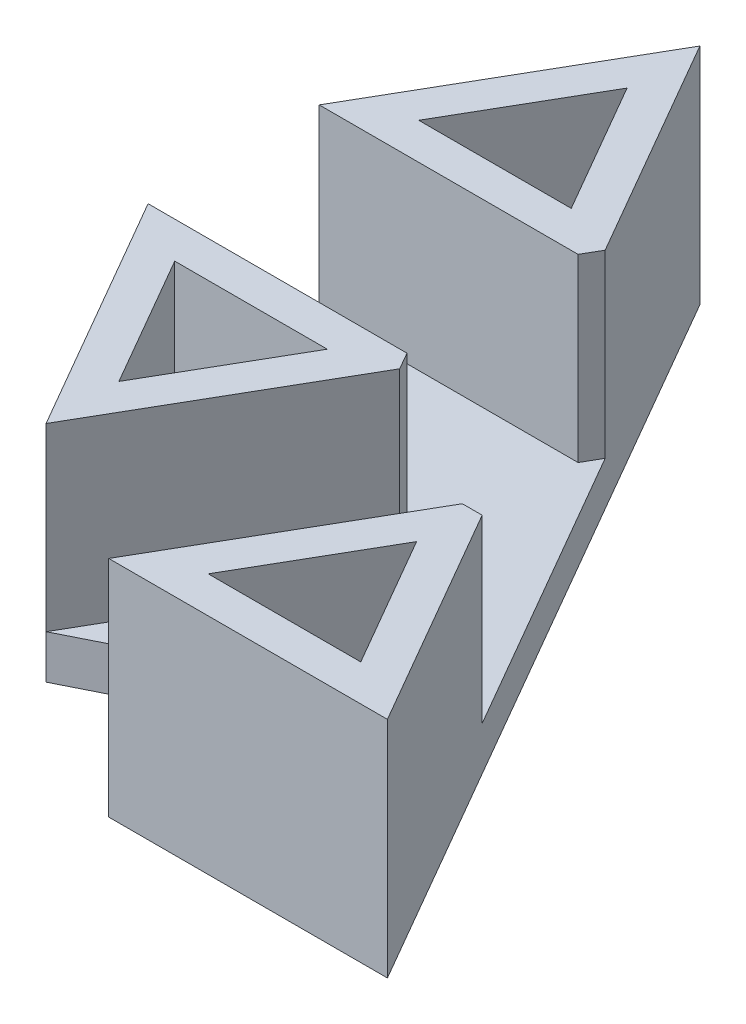
ISO-10303-21;
HEADER;
FILE_DESCRIPTION(('STEP AP214'),'2;1');
FILE_NAME('part.step','',(''),(''),'','','');
FILE_SCHEMA(('AUTOMOTIVE_DESIGN { 1 0 10303 214 1 1 1 1 }'));
ENDSEC;
DATA;
#1=APPLICATION_CONTEXT('core data for automotive mechanical design processes');
#2=APPLICATION_PROTOCOL_DEFINITION('international standard','automotive_design',2000,#1);
#3=PRODUCT_CONTEXT('',#1,'mechanical');
#4=PRODUCT('Part','Part','',(#3));
#5=PRODUCT_RELATED_PRODUCT_CATEGORY('part','',(#4));
#6=PRODUCT_DEFINITION_FORMATION('','',#4);
#7=PRODUCT_DEFINITION_CONTEXT('part definition',#1,'design');
#8=PRODUCT_DEFINITION('design','',#6,#7);
#9=PRODUCT_DEFINITION_SHAPE('','',#8);
#10=(LENGTH_UNIT() NAMED_UNIT(*) SI_UNIT(.MILLI.,.METRE.));
#11=(NAMED_UNIT(*) PLANE_ANGLE_UNIT() SI_UNIT($,.RADIAN.));
#12=(NAMED_UNIT(*) SI_UNIT($,.STERADIAN.) SOLID_ANGLE_UNIT());
#13=UNCERTAINTY_MEASURE_WITH_UNIT(LENGTH_MEASURE(1.E-05),#10,'distance_accuracy_value','');
#14=(GEOMETRIC_REPRESENTATION_CONTEXT(3) GLOBAL_UNCERTAINTY_ASSIGNED_CONTEXT((#13)) GLOBAL_UNIT_ASSIGNED_CONTEXT((#10,
#11,#12)) REPRESENTATION_CONTEXT('',''));
#15=CARTESIAN_POINT('',(0.,0.,0.));
#16=DIRECTION('',(0.,0.,1.));
#17=DIRECTION('',(1.,0.,0.));
#18=AXIS2_PLACEMENT_3D('',#15,#16,#17);
#19=CARTESIAN_POINT('',(0.,15.38,-1.32179677024894));
#20=DIRECTION('',(0.,0.,-1.));
#21=DIRECTION('',(-1.,0.,0.));
#22=AXIS2_PLACEMENT_3D('',#19,#20,#21);
#23=PLANE('',#22);
#24=DIRECTION('',(1.,0.,0.));
#25=VECTOR('',#24,1.);
#26=CARTESIAN_POINT('',(0.,0.,-1.32179677024894));
#27=LINE('',#26,#25);
#28=CARTESIAN_POINT('',(-144.196152421674,0.,-1.32179677024954));
#29=VERTEX_POINT('',#28);
#30=CARTESIAN_POINT('',(-133.72243186399,0.,-1.32179677024951));
#31=VERTEX_POINT('',#30);
#32=EDGE_CURVE('E105',#29,#31,#27,.T.);
#33=ORIENTED_EDGE('',*,*,#32,.F.);
#34=DIRECTION('',(0.,-1.,0.));
#35=VECTOR('',#34,1.);
#36=CARTESIAN_POINT('',(-144.196152421674,15.38,-1.32179677024954));
#37=LINE('',#36,#35);
#38=CARTESIAN_POINT('',(-144.196152421674,15.38,-1.32179677024954));
#39=VERTEX_POINT('',#38);
#40=EDGE_CURVE('E11',#39,#29,#37,.T.);
#41=ORIENTED_EDGE('',*,*,#40,.F.);
#42=DIRECTION('',(1.,0.,0.));
#43=VECTOR('',#42,1.);
#44=CARTESIAN_POINT('',(0.,15.38,-1.32179677024894));
#45=LINE('',#44,#43);
#46=CARTESIAN_POINT('',(-133.72243186399,15.38,-1.32179677024951));
#47=VERTEX_POINT('',#46);
#48=EDGE_CURVE('E104',#39,#47,#45,.T.);
#49=ORIENTED_EDGE('',*,*,#48,.T.);
#50=DIRECTION('',(0.,-1.,0.));
#51=VECTOR('',#50,1.);
#52=CARTESIAN_POINT('',(-133.72243186399,15.38,-1.32179677024951));
#53=LINE('',#52,#51);
#54=EDGE_CURVE('E83',#47,#31,#53,.T.);
#55=ORIENTED_EDGE('',*,*,#54,.T.);
#56=EDGE_LOOP('',(#33,#41,#49,#55));
#57=FACE_BOUND('',#56,.T.);
#58=ADVANCED_FACE('F37',(#57),#23,.T.);
#59=CARTESIAN_POINT('',(-108.719469107093,15.38,-62.7692147551341));
#60=DIRECTION('',(-0.866025403784437,0.,-0.500000000000003));
#61=DIRECTION('',(-0.500000000000003,0.,0.866025403784437));
#62=AXIS2_PLACEMENT_3D('',#59,#60,#61);
#63=PLANE('',#62);
#64=DIRECTION('',(0.500000000000004,0.,-0.866025403784437));
#65=VECTOR('',#64,1.);
#66=CARTESIAN_POINT('',(-108.719469107093,0.,-62.7692147551341));
#67=LINE('',#66,#65);
#68=CARTESIAN_POINT('',(-138.959292142832,0.,-10.3923048453435));
#69=VERTEX_POINT('',#68);
#70=EDGE_CURVE('E129',#29,#69,#67,.T.);
#71=ORIENTED_EDGE('',*,*,#70,.T.);
#72=DIRECTION('',(0.,-1.,0.));
#73=VECTOR('',#72,1.);
#74=CARTESIAN_POINT('',(-138.959292142832,15.38,-10.3923048453435));
#75=LINE('',#74,#73);
#76=CARTESIAN_POINT('',(-138.959292142832,15.38,-10.3923048453435));
#77=VERTEX_POINT('',#76);
#78=EDGE_CURVE('E47',#77,#69,#75,.T.);
#79=ORIENTED_EDGE('',*,*,#78,.F.);
#80=DIRECTION('',(0.500000000000004,0.,-0.866025403784437));
#81=VECTOR('',#80,1.);
#82=CARTESIAN_POINT('',(-108.719469107093,15.38,-62.7692147551341));
#83=LINE('',#82,#81);
#84=EDGE_CURVE('E109',#39,#77,#83,.T.);
#85=ORIENTED_EDGE('',*,*,#84,.F.);
#86=ORIENTED_EDGE('',*,*,#40,.T.);
#87=EDGE_LOOP('',(#71,#79,#85,#86));
#88=FACE_BOUND('',#87,.T.);
#89=ADVANCED_FACE('F110',(#88),#63,.F.);
#90=CARTESIAN_POINT('',(-97.5544055976939,15.38,56.3230623324618));
#91=DIRECTION('',(0.866025403784441,0.,-0.499999999999996));
#92=DIRECTION('',(-0.499999999999996,0.,-0.866025403784441));
#93=AXIS2_PLACEMENT_3D('',#90,#91,#92);
#94=PLANE('',#93);
#95=DIRECTION('',(0.499999999999996,0.,0.866025403784441));
#96=VECTOR('',#95,1.);
#97=CARTESIAN_POINT('',(-97.5544055976939,0.,56.3230623324618));
#98=LINE('',#97,#96);
#99=CARTESIAN_POINT('',(-138.959292142832,0.,-15.3923048453435));
#100=VERTEX_POINT('',#99);
#101=CARTESIAN_POINT('',(-109.649519052832,0.,35.3737113048508));
#102=VERTEX_POINT('',#101);
#103=EDGE_CURVE('E121',#100,#102,#98,.T.);
#104=ORIENTED_EDGE('',*,*,#103,.F.);
#105=DIRECTION('',(0.,-1.,0.));
#106=VECTOR('',#105,1.);
#107=CARTESIAN_POINT('',(-138.959292142832,15.38,-15.3923048453435));
#108=LINE('',#107,#106);
#109=CARTESIAN_POINT('',(-138.959292142832,15.38,-15.3923048453435));
#110=VERTEX_POINT('',#109);
#111=EDGE_CURVE('E41',#110,#100,#108,.T.);
#112=ORIENTED_EDGE('',*,*,#111,.F.);
#113=DIRECTION('',(0.499999999999996,0.,0.866025403784441));
#114=VECTOR('',#113,1.);
#115=CARTESIAN_POINT('',(-97.5544055976939,15.38,56.3230623324618));
#116=LINE('',#115,#114);
#117=CARTESIAN_POINT('',(-130.072540796896,15.38,4.95437024738976E-11));
#118=VERTEX_POINT('',#117);
#119=EDGE_CURVE('E132',#110,#118,#116,.T.);
#120=ORIENTED_EDGE('',*,*,#119,.T.);
#121=DIRECTION('',(0.,-1.,0.));
#122=VECTOR('',#121,1.);
#123=CARTESIAN_POINT('',(-130.072540796896,15.38,4.95437024738976E-11));
#124=LINE('',#123,#122);
#125=CARTESIAN_POINT('',(-130.072540796896,3.,4.95437024738976E-11));
#126=VERTEX_POINT('',#125);
#127=EDGE_CURVE('E120',#118,#126,#124,.T.);
#128=ORIENTED_EDGE('',*,*,#127,.T.);
#129=DIRECTION('',(0.500000000000004,0.,0.866025403784436));
#130=VECTOR('',#129,1.);
#131=CARTESIAN_POINT('',(-97.5544055976927,3.,56.3230623324625));
#132=LINE('',#131,#130);
#133=CARTESIAN_POINT('',(-118.536270398769,3.,19.9814064594578));
#134=VERTEX_POINT('',#133);
#135=EDGE_CURVE('E278',#126,#134,#132,.T.);
#136=ORIENTED_EDGE('',*,*,#135,.T.);
#137=DIRECTION('',(0.,-1.,0.));
#138=VECTOR('',#137,1.);
#139=CARTESIAN_POINT('',(-118.536270398769,15.38,19.9814064594578));
#140=LINE('',#139,#138);
#141=CARTESIAN_POINT('',(-118.536270398769,15.38,19.9814064594578));
#142=VERTEX_POINT('',#141);
#143=EDGE_CURVE('E175',#142,#134,#140,.T.);
#144=ORIENTED_EDGE('',*,*,#143,.F.);
#145=DIRECTION('',(0.500000000000011,0.,0.866025403784432));
#146=VECTOR('',#145,1.);
#147=CARTESIAN_POINT('',(-97.554405597692,15.38,56.3230623324631));
#148=LINE('',#147,#146);
#149=CARTESIAN_POINT('',(-109.649519052832,15.38,35.3737113048508));
#150=VERTEX_POINT('',#149);
#151=EDGE_CURVE('E169',#142,#150,#148,.T.);
#152=ORIENTED_EDGE('',*,*,#151,.T.);
#153=DIRECTION('',(0.,-1.,0.));
#154=VECTOR('',#153,1.);
#155=CARTESIAN_POINT('',(-109.649519052832,15.38,35.3737113048508));
#156=LINE('',#155,#154);
#157=EDGE_CURVE('E164',#150,#102,#156,.T.);
#158=ORIENTED_EDGE('',*,*,#157,.T.);
#159=EDGE_LOOP('',(#104,#112,#120,#128,#136,#144,#152,#158));
#160=FACE_BOUND('',#159,.T.);
#161=ADVANCED_FACE('F39',(#160),#94,.T.);
#162=CARTESIAN_POINT('',(-110.884532616554,15.38,-64.0192147551343));
#163=DIRECTION('',(0.866025403784436,0.,0.500000000000004));
#164=DIRECTION('',(0.500000000000004,0.,-0.866025403784436));
#165=AXIS2_PLACEMENT_3D('',#162,#163,#164);
#166=PLANE('',#165);
#167=DIRECTION('',(-0.500000000000004,0.,0.866025403784436));
#168=VECTOR('',#167,1.);
#169=CARTESIAN_POINT('',(-110.884532616554,0.,-64.0192147551343));
#170=LINE('',#169,#168);
#171=CARTESIAN_POINT('',(-148.526279440597,0.,1.1782032297504));
#172=VERTEX_POINT('',#171);
#173=EDGE_CURVE('E124',#100,#172,#170,.T.);
#174=ORIENTED_EDGE('',*,*,#173,.T.);
#175=DIRECTION('',(0.,-1.,0.));
#176=VECTOR('',#175,1.);
#177=CARTESIAN_POINT('',(-148.526279440597,3.,1.1782032297504));
#178=LINE('',#177,#176);
#179=CARTESIAN_POINT('',(-148.526279440597,3.,1.1782032297504));
#180=VERTEX_POINT('',#179);
#181=EDGE_CURVE('E324',#180,#172,#178,.T.);
#182=ORIENTED_EDGE('',*,*,#181,.F.);
#183=DIRECTION('',(0.,-1.,0.));
#184=VECTOR('',#183,1.);
#185=CARTESIAN_POINT('',(-148.526279440597,15.38,1.1782032297504));
#186=LINE('',#185,#184);
#187=CARTESIAN_POINT('',(-148.526279440597,15.38,1.1782032297504));
#188=VERTEX_POINT('',#187);
#189=EDGE_CURVE('E139',#188,#180,#186,.T.);
#190=ORIENTED_EDGE('',*,*,#189,.F.);
#191=DIRECTION('',(-0.500000000000004,0.,0.866025403784436));
#192=VECTOR('',#191,1.);
#193=CARTESIAN_POINT('',(-110.884532616554,15.38,-64.0192147551343));
#194=LINE('',#193,#192);
#195=EDGE_CURVE('E150',#110,#188,#194,.T.);
#196=ORIENTED_EDGE('',*,*,#195,.F.);
#197=ORIENTED_EDGE('',*,*,#111,.T.);
#198=EDGE_LOOP('',(#174,#182,#190,#196,#197));
#199=FACE_BOUND('',#198,.T.);
#200=ADVANCED_FACE('F148',(#199),#166,.F.);
#201=CARTESIAN_POINT('',(0.,15.38,1.17820322975003));
#202=DIRECTION('',(0.,0.,1.));
#203=DIRECTION('',(1.,0.,0.));
#204=AXIS2_PLACEMENT_3D('',#201,#202,#203);
#205=PLANE('',#204);
#206=DIRECTION('',(-1.,0.,0.));
#207=VECTOR('',#206,1.);
#208=CARTESIAN_POINT('',(0.,3.,1.17820322975003));
#209=LINE('',#208,#207);
#210=CARTESIAN_POINT('',(-130.752776748724,3.,1.17820322975036));
#211=VERTEX_POINT('',#210);
#212=EDGE_CURVE('E284',#211,#180,#209,.T.);
#213=ORIENTED_EDGE('',*,*,#212,.F.);
#214=DIRECTION('',(0.,-1.,0.));
#215=VECTOR('',#214,1.);
#216=CARTESIAN_POINT('',(-130.752776748724,15.38,1.17820322975036));
#217=LINE('',#216,#215);
#218=CARTESIAN_POINT('',(-130.752776748724,15.38,1.17820322975036));
#219=VERTEX_POINT('',#218);
#220=EDGE_CURVE('E137',#219,#211,#217,.T.);
#221=ORIENTED_EDGE('',*,*,#220,.F.);
#222=DIRECTION('',(-1.,0.,0.));
#223=VECTOR('',#222,1.);
#224=CARTESIAN_POINT('',(0.,15.38,1.17820322975003));
#225=LINE('',#224,#223);
#226=EDGE_CURVE('E115',#219,#188,#225,.T.);
#227=ORIENTED_EDGE('',*,*,#226,.T.);
#228=ORIENTED_EDGE('',*,*,#189,.T.);
#229=EDGE_LOOP('',(#213,#221,#227,#228));
#230=FACE_BOUND('',#229,.T.);
#231=ADVANCED_FACE('F329',(#230),#205,.T.);
#232=CARTESIAN_POINT('',(-97.5544055976511,15.38,-56.323062332437));
#233=DIRECTION('',(-0.866025403784442,0.,-0.499999999999995));
#234=DIRECTION('',(-0.499999999999995,0.,0.866025403784442));
#235=AXIS2_PLACEMENT_3D('',#232,#233,#234);
#236=PLANE('',#235);
#237=ORIENTED_EDGE('',*,*,#220,.T.);
#238=DIRECTION('',(0.499999999999995,0.,-0.866025403784442));
#239=VECTOR('',#238,1.);
#240=CARTESIAN_POINT('',(-97.5544055976511,3.,-56.323062332437));
#241=LINE('',#240,#239);
#242=EDGE_CURVE('E281',#211,#126,#241,.T.);
#243=ORIENTED_EDGE('',*,*,#242,.T.);
#244=ORIENTED_EDGE('',*,*,#127,.F.);
#245=DIRECTION('',(0.499999999999995,0.,-0.866025403784442));
#246=VECTOR('',#245,1.);
#247=CARTESIAN_POINT('',(-97.5544055976511,15.38,-56.323062332437));
#248=LINE('',#247,#246);
#249=EDGE_CURVE('E113',#219,#118,#248,.T.);
#250=ORIENTED_EDGE('',*,*,#249,.F.);
#251=EDGE_LOOP('',(#237,#243,#244,#250));
#252=FACE_BOUND('',#251,.T.);
#253=ADVANCED_FACE('F382',(#252),#236,.F.);
#254=CARTESIAN_POINT('',(-99.7194691071534,15.38,57.5730623324625));
#255=DIRECTION('',(0.866025403784435,0.,-0.500000000000005));
#256=DIRECTION('',(-0.500000000000005,0.,-0.866025403784435));
#257=AXIS2_PLACEMENT_3D('',#254,#255,#256);
#258=PLANE('',#257);
#259=DIRECTION('',(0.500000000000006,0.,0.866025403784436));
#260=VECTOR('',#259,1.);
#261=CARTESIAN_POINT('',(-99.7194691071534,0.,57.5730623324625));
#262=LINE('',#261,#260);
#263=EDGE_CURVE('E76',#69,#31,#262,.T.);
#264=ORIENTED_EDGE('',*,*,#263,.T.);
#265=ORIENTED_EDGE('',*,*,#54,.F.);
#266=DIRECTION('',(0.500000000000006,0.,0.866025403784436));
#267=VECTOR('',#266,1.);
#268=CARTESIAN_POINT('',(-99.7194691071534,15.38,57.5730623324625));
#269=LINE('',#268,#267);
#270=EDGE_CURVE('E56',#77,#47,#269,.T.);
#271=ORIENTED_EDGE('',*,*,#270,.F.);
#272=ORIENTED_EDGE('',*,*,#78,.T.);
#273=EDGE_LOOP('',(#264,#265,#271,#272));
#274=FACE_BOUND('',#273,.T.);
#275=ADVANCED_FACE('F524',(#274),#258,.F.);
#276=CARTESIAN_POINT('',(0.,15.38,0.));
#277=DIRECTION('',(0.,1.,0.));
#278=DIRECTION('',(0.,0.,1.));
#279=AXIS2_PLACEMENT_3D('',#276,#277,#278);
#280=PLANE('',#279);
#281=ORIENTED_EDGE('',*,*,#119,.F.);
#282=ORIENTED_EDGE('',*,*,#195,.T.);
#283=ORIENTED_EDGE('',*,*,#226,.F.);
#284=ORIENTED_EDGE('',*,*,#249,.T.);
#285=EDGE_LOOP('',(#281,#282,#283,#284));
#286=FACE_BOUND('',#285,.T.);
#287=ORIENTED_EDGE('',*,*,#48,.F.);
#288=ORIENTED_EDGE('',*,*,#84,.T.);
#289=ORIENTED_EDGE('',*,*,#270,.T.);
#290=EDGE_LOOP('',(#287,#288,#289));
#291=FACE_BOUND('',#290,.T.);
#292=ADVANCED_FACE('F112',(#286,#291),#280,.T.);
#293=CARTESIAN_POINT('',(0.,0.,0.));
#294=DIRECTION('',(0.,1.,0.));
#295=DIRECTION('',(0.,0.,1.));
#296=AXIS2_PLACEMENT_3D('',#293,#294,#295);
#297=PLANE('',#296);
#298=DIRECTION('',(-0.500000000000013,0.,-0.866025403784431));
#299=VECTOR('',#298,1.);
#300=CARTESIAN_POINT('',(-116.992785791573,0.,67.5458163700115));
#301=LINE('',#300,#299);
#302=CARTESIAN_POINT('',(-138.959292142832,0.,29.4987113048487));
#303=VERTEX_POINT('',#302);
#304=CARTESIAN_POINT('',(-148.526279440596,0.,12.9282032297549));
#305=VERTEX_POINT('',#304);
#306=EDGE_CURVE('E219',#303,#305,#301,.T.);
#307=ORIENTED_EDGE('',*,*,#306,.T.);
#308=DIRECTION('',(0.834188655635127,0.,-0.551479180758132));
#309=VECTOR('',#308,1.);
#310=CARTESIAN_POINT('',(-39.2237308648219,0.,-59.331326477527));
#311=LINE('',#310,#309);
#312=CARTESIAN_POINT('',(-139.63952809466,0.,7.05320322975262));
#313=VERTEX_POINT('',#312);
#314=EDGE_CURVE('E309',#305,#313,#311,.T.);
#315=ORIENTED_EDGE('',*,*,#314,.T.);
#316=DIRECTION('',(0.834188655635133,0.,0.551479180758122));
#317=VECTOR('',#316,1.);
#318=CARTESIAN_POINT('',(-45.7132093149093,0.,69.1475616010552));
#319=LINE('',#318,#317);
#320=EDGE_CURVE('E160',#172,#313,#319,.T.);
#321=ORIENTED_EDGE('',*,*,#320,.F.);
#322=ORIENTED_EDGE('',*,*,#173,.F.);
#323=ORIENTED_EDGE('',*,*,#103,.T.);
#324=DIRECTION('',(1.,0.,0.));
#325=VECTOR('',#324,1.);
#326=CARTESIAN_POINT('',(1.92422981832398E-13,0.,35.3737113048502));
#327=LINE('',#326,#325);
#328=CARTESIAN_POINT('',(-128.783493648361,0.,35.3737113048509));
#329=VERTEX_POINT('',#328);
#330=EDGE_CURVE('E178',#329,#102,#327,.T.);
#331=ORIENTED_EDGE('',*,*,#330,.F.);
#332=DIRECTION('',(0.0605006523772137,0.,0.998168157707874));
#333=VECTOR('',#332,1.);
#334=CARTESIAN_POINT('',(-130.448315925334,0.,7.90669202783896));
#335=LINE('',#334,#333);
#336=CARTESIAN_POINT('',(-129.428017222628,0.,24.7400588821532));
#337=VERTEX_POINT('',#336);
#338=EDGE_CURVE('E260',#337,#329,#335,.T.);
#339=ORIENTED_EDGE('',*,*,#338,.F.);
#340=DIRECTION('',(-0.894689308012325,0.,0.446688976949765));
#341=VECTOR('',#340,1.);
#342=CARTESIAN_POINT('',(-15.9375957742609,0.,-31.9219798796541));
#343=LINE('',#342,#341);
#344=EDGE_CURVE('E272',#337,#303,#343,.T.);
#345=ORIENTED_EDGE('',*,*,#344,.T.);
#346=EDGE_LOOP('',(#307,#315,#321,#322,#323,#331,#339,#345));
#347=FACE_BOUND('',#346,.T.);
#348=ORIENTED_EDGE('',*,*,#32,.T.);
#349=ORIENTED_EDGE('',*,*,#263,.F.);
#350=ORIENTED_EDGE('',*,*,#70,.F.);
#351=EDGE_LOOP('',(#348,#349,#350));
#352=FACE_BOUND('',#351,.T.);
#353=DIRECTION('',(0.500000000000014,0.,0.866025403784431));
#354=VECTOR('',#353,1.);
#355=CARTESIAN_POINT('',(-114.827722282112,0.,66.2958163700115));
#356=LINE('',#355,#354);
#357=CARTESIAN_POINT('',(-144.196152421674,0.,15.4282032297548));
#358=VERTEX_POINT('',#357);
#359=CARTESIAN_POINT('',(-138.959292142832,0.,24.4987113048488));
#360=VERTEX_POINT('',#359);
#361=EDGE_CURVE('E208',#358,#360,#356,.T.);
#362=ORIENTED_EDGE('',*,*,#361,.T.);
#363=DIRECTION('',(0.499999999999995,0.,-0.866025403784441));
#364=VECTOR('',#363,1.);
#365=CARTESIAN_POINT('',(-93.6112159321346,0.,-54.0464607175854));
#366=LINE('',#365,#364);
#367=CARTESIAN_POINT('',(-133.72243186399,0.,15.4282032297547));
#368=VERTEX_POINT('',#367);
#369=EDGE_CURVE('E243',#360,#368,#366,.T.);
#370=ORIENTED_EDGE('',*,*,#369,.T.);
#371=DIRECTION('',(1.,0.,0.));
#372=VECTOR('',#371,1.);
#373=CARTESIAN_POINT('',(2.35089077395178E-13,0.,15.4282032297526));
#374=LINE('',#373,#372);
#375=EDGE_CURVE('E240',#358,#368,#374,.T.);
#376=ORIENTED_EDGE('',*,*,#375,.F.);
#377=EDGE_LOOP('',(#362,#370,#376));
#378=FACE_BOUND('',#377,.T.);
#379=DIRECTION('',(-0.500000000000003,0.,-0.866025403784437));
#380=VECTOR('',#379,1.);
#381=CARTESIAN_POINT('',(-99.7194691071538,0.,57.5730623324622));
#382=LINE('',#381,#380);
#383=CARTESIAN_POINT('',(-113.979646071754,0.,32.8737113048507));
#384=VERTEX_POINT('',#383);
#385=CARTESIAN_POINT('',(-119.216506350597,0.,23.8032032297566));
#386=VERTEX_POINT('',#385);
#387=EDGE_CURVE('E184',#384,#386,#382,.T.);
#388=ORIENTED_EDGE('',*,*,#387,.T.);
#389=DIRECTION('',(0.499999999999984,0.,-0.866025403784448));
#390=VECTOR('',#389,1.);
#391=CARTESIAN_POINT('',(-79.1052904187432,0.,-45.671460717583));
#392=LINE('',#391,#390);
#393=CARTESIAN_POINT('',(-124.453366629439,0.,32.8737113048508));
#394=VERTEX_POINT('',#393);
#395=EDGE_CURVE('E195',#394,#386,#392,.T.);
#396=ORIENTED_EDGE('',*,*,#395,.F.);
#397=DIRECTION('',(-1.,0.,0.));
#398=VECTOR('',#397,1.);
#399=CARTESIAN_POINT('',(3.70243056721553E-13,0.,32.8737113048494));
#400=LINE('',#399,#398);
#401=EDGE_CURVE('E187',#384,#394,#400,.T.);
#402=ORIENTED_EDGE('',*,*,#401,.F.);
#403=EDGE_LOOP('',(#388,#396,#402));
#404=FACE_BOUND('',#403,.T.);
#405=ADVANCED_FACE('F154',(#347,#352,#378,#404),#297,.F.);
#406=CARTESIAN_POINT('',(-130.448315925334,3.,7.90669202783896));
#407=DIRECTION('',(0.998168157707874,0.,-0.0605006523772137));
#408=DIRECTION('',(-0.0605006523772137,0.,-0.998168157707874));
#409=AXIS2_PLACEMENT_3D('',#406,#407,#408);
#410=PLANE('',#409);
#411=ORIENTED_EDGE('',*,*,#338,.T.);
#412=DIRECTION('',(0.,-1.,0.));
#413=VECTOR('',#412,1.);
#414=CARTESIAN_POINT('',(-128.783493648361,3.,35.3737113048509));
#415=LINE('',#414,#413);
#416=CARTESIAN_POINT('',(-128.783493648361,3.,35.3737113048509));
#417=VERTEX_POINT('',#416);
#418=EDGE_CURVE('E125',#417,#329,#415,.T.);
#419=ORIENTED_EDGE('',*,*,#418,.F.);
#420=DIRECTION('',(0.0605006523772137,0.,0.998168157707874));
#421=VECTOR('',#420,1.);
#422=CARTESIAN_POINT('',(-130.448315925334,3.,7.90669202783896));
#423=LINE('',#422,#421);
#424=CARTESIAN_POINT('',(-129.428017222628,3.,24.7400588821532));
#425=VERTEX_POINT('',#424);
#426=EDGE_CURVE('E268',#425,#417,#423,.T.);
#427=ORIENTED_EDGE('',*,*,#426,.F.);
#428=DIRECTION('',(0.,-1.,0.));
#429=VECTOR('',#428,1.);
#430=CARTESIAN_POINT('',(-129.428017222628,3.,24.7400588821532));
#431=LINE('',#430,#429);
#432=EDGE_CURVE('E305',#425,#337,#431,.T.);
#433=ORIENTED_EDGE('',*,*,#432,.T.);
#434=EDGE_LOOP('',(#411,#419,#427,#433));
#435=FACE_BOUND('',#434,.T.);
#436=ADVANCED_FACE('F498',(#435),#410,.F.);
#437=CARTESIAN_POINT('',(-45.7132093149093,3.,69.1475616010552));
#438=DIRECTION('',(0.551479180758122,0.,-0.834188655635133));
#439=DIRECTION('',(-0.834188655635133,0.,-0.551479180758122));
#440=AXIS2_PLACEMENT_3D('',#437,#438,#439);
#441=PLANE('',#440);
#442=ORIENTED_EDGE('',*,*,#320,.T.);
#443=DIRECTION('',(0.,-1.,0.));
#444=VECTOR('',#443,1.);
#445=CARTESIAN_POINT('',(-139.63952809466,3.,7.05320322975262));
#446=LINE('',#445,#444);
#447=CARTESIAN_POINT('',(-139.63952809466,3.,7.05320322975262));
#448=VERTEX_POINT('',#447);
#449=EDGE_CURVE('E321',#448,#313,#446,.T.);
#450=ORIENTED_EDGE('',*,*,#449,.F.);
#451=DIRECTION('',(0.834188655635133,0.,0.551479180758122));
#452=VECTOR('',#451,1.);
#453=CARTESIAN_POINT('',(-45.7132093149093,3.,69.1475616010552));
#454=LINE('',#453,#452);
#455=EDGE_CURVE('E287',#180,#448,#454,.T.);
#456=ORIENTED_EDGE('',*,*,#455,.F.);
#457=ORIENTED_EDGE('',*,*,#181,.T.);
#458=EDGE_LOOP('',(#442,#450,#456,#457));
#459=FACE_BOUND('',#458,.T.);
#460=ADVANCED_FACE('F338',(#459),#441,.F.);
#461=CARTESIAN_POINT('',(-39.2237308648219,3.,-59.331326477527));
#462=DIRECTION('',(-0.551479180758132,0.,-0.834188655635127));
#463=DIRECTION('',(-0.834188655635127,0.,0.551479180758132));
#464=AXIS2_PLACEMENT_3D('',#461,#462,#463);
#465=PLANE('',#464);
#466=ORIENTED_EDGE('',*,*,#314,.F.);
#467=DIRECTION('',(0.,-1.,0.));
#468=VECTOR('',#467,1.);
#469=CARTESIAN_POINT('',(-148.526279440596,3.,12.9282032297549));
#470=LINE('',#469,#468);
#471=CARTESIAN_POINT('',(-148.526279440596,3.,12.9282032297549));
#472=VERTEX_POINT('',#471);
#473=EDGE_CURVE('E318',#472,#305,#470,.T.);
#474=ORIENTED_EDGE('',*,*,#473,.F.);
#475=DIRECTION('',(0.834188655635127,0.,-0.551479180758132));
#476=VECTOR('',#475,1.);
#477=CARTESIAN_POINT('',(-39.2237308648219,3.,-59.331326477527));
#478=LINE('',#477,#476);
#479=EDGE_CURVE('E290',#472,#448,#478,.T.);
#480=ORIENTED_EDGE('',*,*,#479,.T.);
#481=ORIENTED_EDGE('',*,*,#449,.T.);
#482=EDGE_LOOP('',(#466,#474,#480,#481));
#483=FACE_BOUND('',#482,.T.);
#484=ADVANCED_FACE('F578',(#483),#465,.T.);
#485=CARTESIAN_POINT('',(-15.9375957742609,3.,-31.9219798796541));
#486=DIRECTION('',(0.446688976949765,0.,0.894689308012325));
#487=DIRECTION('',(0.894689308012325,0.,-0.446688976949765));
#488=AXIS2_PLACEMENT_3D('',#485,#486,#487);
#489=PLANE('',#488);
#490=ORIENTED_EDGE('',*,*,#344,.F.);
#491=ORIENTED_EDGE('',*,*,#432,.F.);
#492=DIRECTION('',(-0.894689308012325,0.,0.446688976949765));
#493=VECTOR('',#492,1.);
#494=CARTESIAN_POINT('',(-15.9375957742609,3.,-31.9219798796541));
#495=LINE('',#494,#493);
#496=CARTESIAN_POINT('',(-138.959292142832,3.,29.4987113048487));
#497=VERTEX_POINT('',#496);
#498=EDGE_CURVE('E302',#425,#497,#495,.T.);
#499=ORIENTED_EDGE('',*,*,#498,.T.);
#500=DIRECTION('',(0.,-1.,0.));
#501=VECTOR('',#500,1.);
#502=CARTESIAN_POINT('',(-138.959292142832,3.,29.4987113048487));
#503=LINE('',#502,#501);
#504=EDGE_CURVE('E315',#497,#303,#503,.T.);
#505=ORIENTED_EDGE('',*,*,#504,.T.);
#506=EDGE_LOOP('',(#490,#491,#499,#505));
#507=FACE_BOUND('',#506,.T.);
#508=ADVANCED_FACE('F497',(#507),#489,.T.);
#509=CARTESIAN_POINT('',(0.,3.,0.));
#510=DIRECTION('',(0.,1.,0.));
#511=DIRECTION('',(0.,0.,1.));
#512=AXIS2_PLACEMENT_3D('',#509,#510,#511);
#513=PLANE('',#512);
#514=ORIENTED_EDGE('',*,*,#426,.T.);
#515=DIRECTION('',(0.499999999999995,0.,-0.866025403784442));
#516=VECTOR('',#515,1.);
#517=CARTESIAN_POINT('',(-81.2703539282027,3.,-46.9214607175833));
#518=LINE('',#517,#516);
#519=CARTESIAN_POINT('',(-119.896742302425,3.,19.9814064594578));
#520=VERTEX_POINT('',#519);
#521=EDGE_CURVE('E271',#417,#520,#518,.T.);
#522=ORIENTED_EDGE('',*,*,#521,.T.);
#523=DIRECTION('',(-1.,0.,0.));
#524=VECTOR('',#523,1.);
#525=CARTESIAN_POINT('',(2.03824656871567E-13,3.,19.9814064594566));
#526=LINE('',#525,#524);
#527=EDGE_CURVE('E275',#134,#520,#526,.T.);
#528=ORIENTED_EDGE('',*,*,#527,.F.);
#529=ORIENTED_EDGE('',*,*,#135,.F.);
#530=ORIENTED_EDGE('',*,*,#242,.F.);
#531=ORIENTED_EDGE('',*,*,#212,.T.);
#532=ORIENTED_EDGE('',*,*,#455,.T.);
#533=ORIENTED_EDGE('',*,*,#479,.F.);
#534=DIRECTION('',(-1.,0.,0.));
#535=VECTOR('',#534,1.);
#536=CARTESIAN_POINT('',(1.08516019092807E-13,3.,12.9282032297537));
#537=LINE('',#536,#535);
#538=CARTESIAN_POINT('',(-130.752776748724,3.,12.9282032297548));
#539=VERTEX_POINT('',#538);
#540=EDGE_CURVE('E293',#539,#472,#537,.T.);
#541=ORIENTED_EDGE('',*,*,#540,.F.);
#542=DIRECTION('',(0.500000000000012,0.,0.866025403784432));
#543=VECTOR('',#542,1.);
#544=CARTESIAN_POINT('',(-103.662658772669,3.,59.8496639473147));
#545=LINE('',#544,#543);
#546=CARTESIAN_POINT('',(-130.072540796896,3.,14.1064064594556));
#547=VERTEX_POINT('',#546);
#548=EDGE_CURVE('E296',#539,#547,#545,.T.);
#549=ORIENTED_EDGE('',*,*,#548,.T.);
#550=DIRECTION('',(0.499999999999986,0.,-0.866025403784446));
#551=VECTOR('',#550,1.);
#552=CARTESIAN_POINT('',(-91.4461524226749,3.,-52.796460717585));
#553=LINE('',#552,#551);
#554=EDGE_CURVE('E299',#497,#547,#553,.T.);
#555=ORIENTED_EDGE('',*,*,#554,.F.);
#556=ORIENTED_EDGE('',*,*,#498,.F.);
#557=EDGE_LOOP('',(#514,#522,#528,#529,#530,#531,#532,#533,#541,#549,#555,#556));
#558=FACE_BOUND('',#557,.T.);
#559=ADVANCED_FACE('F343',(#558),#513,.T.);
#560=CARTESIAN_POINT('',(-103.662658772669,15.38,59.8496639473147));
#561=DIRECTION('',(0.866025403784432,0.,-0.500000000000012));
#562=DIRECTION('',(-0.500000000000012,0.,-0.866025403784432));
#563=AXIS2_PLACEMENT_3D('',#560,#561,#562);
#564=PLANE('',#563);
#565=DIRECTION('',(0.,-1.,0.));
#566=VECTOR('',#565,1.);
#567=CARTESIAN_POINT('',(-130.072540796896,15.38,14.1064064594556));
#568=LINE('',#567,#566);
#569=CARTESIAN_POINT('',(-130.072540796896,15.38,14.1064064594556));
#570=VERTEX_POINT('',#569);
#571=EDGE_CURVE('E247',#570,#547,#568,.T.);
#572=ORIENTED_EDGE('',*,*,#571,.T.);
#573=ORIENTED_EDGE('',*,*,#548,.F.);
#574=DIRECTION('',(0.,-1.,0.));
#575=VECTOR('',#574,1.);
#576=CARTESIAN_POINT('',(-130.752776748724,15.38,12.9282032297548));
#577=LINE('',#576,#575);
#578=CARTESIAN_POINT('',(-130.752776748724,15.38,12.9282032297548));
#579=VERTEX_POINT('',#578);
#580=EDGE_CURVE('E257',#579,#539,#577,.T.);
#581=ORIENTED_EDGE('',*,*,#580,.F.);
#582=DIRECTION('',(0.500000000000012,0.,0.866025403784432));
#583=VECTOR('',#582,1.);
#584=CARTESIAN_POINT('',(-103.662658772669,15.38,59.8496639473147));
#585=LINE('',#584,#583);
#586=EDGE_CURVE('E225',#579,#570,#585,.T.);
#587=ORIENTED_EDGE('',*,*,#586,.T.);
#588=EDGE_LOOP('',(#572,#573,#581,#587));
#589=FACE_BOUND('',#588,.T.);
#590=ADVANCED_FACE('F489',(#589),#564,.T.);
#591=CARTESIAN_POINT('',(1.08516019092807E-13,15.38,12.9282032297537));
#592=DIRECTION('',(0.,0.,1.));
#593=DIRECTION('',(1.,0.,0.));
#594=AXIS2_PLACEMENT_3D('',#591,#592,#593);
#595=PLANE('',#594);
#596=ORIENTED_EDGE('',*,*,#540,.T.);
#597=DIRECTION('',(0.,-1.,0.));
#598=VECTOR('',#597,1.);
#599=CARTESIAN_POINT('',(-148.526279440596,15.38,12.9282032297549));
#600=LINE('',#599,#598);
#601=CARTESIAN_POINT('',(-148.526279440596,15.38,12.9282032297549));
#602=VERTEX_POINT('',#601);
#603=EDGE_CURVE('E254',#602,#472,#600,.T.);
#604=ORIENTED_EDGE('',*,*,#603,.F.);
#605=DIRECTION('',(-1.,0.,0.));
#606=VECTOR('',#605,1.);
#607=CARTESIAN_POINT('',(1.08516019092807E-13,15.38,12.9282032297537));
#608=LINE('',#607,#606);
#609=EDGE_CURVE('E228',#579,#602,#608,.T.);
#610=ORIENTED_EDGE('',*,*,#609,.F.);
#611=ORIENTED_EDGE('',*,*,#580,.T.);
#612=EDGE_LOOP('',(#596,#604,#610,#611));
#613=FACE_BOUND('',#612,.T.);
#614=ADVANCED_FACE('F492',(#613),#595,.F.);
#615=CARTESIAN_POINT('',(-116.992785791573,15.38,67.5458163700115));
#616=DIRECTION('',(-0.866025403784431,0.,0.500000000000013));
#617=DIRECTION('',(0.500000000000013,0.,0.866025403784431));
#618=AXIS2_PLACEMENT_3D('',#615,#616,#617);
#619=PLANE('',#618);
#620=ORIENTED_EDGE('',*,*,#306,.F.);
#621=ORIENTED_EDGE('',*,*,#504,.F.);
#622=DIRECTION('',(0.,-1.,0.));
#623=VECTOR('',#622,1.);
#624=CARTESIAN_POINT('',(-138.959292142832,15.38,29.4987113048487));
#625=LINE('',#624,#623);
#626=CARTESIAN_POINT('',(-138.959292142832,15.38,29.4987113048487));
#627=VERTEX_POINT('',#626);
#628=EDGE_CURVE('E250',#627,#497,#625,.T.);
#629=ORIENTED_EDGE('',*,*,#628,.F.);
#630=DIRECTION('',(-0.500000000000013,0.,-0.866025403784431));
#631=VECTOR('',#630,1.);
#632=CARTESIAN_POINT('',(-116.992785791573,15.38,67.5458163700115));
#633=LINE('',#632,#631);
#634=EDGE_CURVE('E231',#627,#602,#633,.T.);
#635=ORIENTED_EDGE('',*,*,#634,.T.);
#636=ORIENTED_EDGE('',*,*,#603,.T.);
#637=ORIENTED_EDGE('',*,*,#473,.T.);
#638=EDGE_LOOP('',(#620,#621,#629,#635,#636,#637));
#639=FACE_BOUND('',#638,.T.);
#640=ADVANCED_FACE('F495',(#639),#619,.T.);
#641=CARTESIAN_POINT('',(-114.827722282112,15.38,66.2958163700115));
#642=DIRECTION('',(0.866025403784431,0.,-0.500000000000014));
#643=DIRECTION('',(-0.500000000000014,0.,-0.866025403784431));
#644=AXIS2_PLACEMENT_3D('',#641,#642,#643);
#645=PLANE('',#644);
#646=ORIENTED_EDGE('',*,*,#361,.F.);
#647=DIRECTION('',(0.,-1.,0.));
#648=VECTOR('',#647,1.);
#649=CARTESIAN_POINT('',(-144.196152421674,15.38,15.4282032297548));
#650=LINE('',#649,#648);
#651=CARTESIAN_POINT('',(-144.196152421674,15.38,15.4282032297548));
#652=VERTEX_POINT('',#651);
#653=EDGE_CURVE('E251',#652,#358,#650,.T.);
#654=ORIENTED_EDGE('',*,*,#653,.F.);
#655=DIRECTION('',(0.500000000000014,0.,0.866025403784431));
#656=VECTOR('',#655,1.);
#657=CARTESIAN_POINT('',(-114.827722282112,15.38,66.2958163700115));
#658=LINE('',#657,#656);
#659=CARTESIAN_POINT('',(-138.959292142832,15.38,24.4987113048488));
#660=VERTEX_POINT('',#659);
#661=EDGE_CURVE('E215',#652,#660,#658,.T.);
#662=ORIENTED_EDGE('',*,*,#661,.T.);
#663=DIRECTION('',(0.,-1.,0.));
#664=VECTOR('',#663,1.);
#665=CARTESIAN_POINT('',(-138.959292142832,15.38,24.4987113048488));
#666=LINE('',#665,#664);
#667=EDGE_CURVE('E237',#660,#360,#666,.T.);
#668=ORIENTED_EDGE('',*,*,#667,.T.);
#669=EDGE_LOOP('',(#646,#654,#662,#668));
#670=FACE_BOUND('',#669,.T.);
#671=ADVANCED_FACE('F464',(#670),#645,.T.);
#672=CARTESIAN_POINT('',(2.35089077395178E-13,15.38,15.4282032297526));
#673=DIRECTION('',(0.,0.,-1.));
#674=DIRECTION('',(-1.,0.,0.));
#675=AXIS2_PLACEMENT_3D('',#672,#673,#674);
#676=PLANE('',#675);
#677=ORIENTED_EDGE('',*,*,#375,.T.);
#678=DIRECTION('',(0.,-1.,0.));
#679=VECTOR('',#678,1.);
#680=CARTESIAN_POINT('',(-133.72243186399,15.38,15.4282032297547));
#681=LINE('',#680,#679);
#682=CARTESIAN_POINT('',(-133.72243186399,15.38,15.4282032297547));
#683=VERTEX_POINT('',#682);
#684=EDGE_CURVE('E263',#683,#368,#681,.T.);
#685=ORIENTED_EDGE('',*,*,#684,.F.);
#686=DIRECTION('',(1.,0.,0.));
#687=VECTOR('',#686,1.);
#688=CARTESIAN_POINT('',(2.35089077395178E-13,15.38,15.4282032297526));
#689=LINE('',#688,#687);
#690=EDGE_CURVE('E218',#652,#683,#689,.T.);
#691=ORIENTED_EDGE('',*,*,#690,.F.);
#692=ORIENTED_EDGE('',*,*,#653,.T.);
#693=EDGE_LOOP('',(#677,#685,#691,#692));
#694=FACE_BOUND('',#693,.T.);
#695=ADVANCED_FACE('F475',(#694),#676,.F.);
#696=CARTESIAN_POINT('',(-93.6112159321346,15.38,-54.0464607175854));
#697=DIRECTION('',(-0.866025403784441,0.,-0.499999999999995));
#698=DIRECTION('',(-0.499999999999995,0.,0.866025403784441));
#699=AXIS2_PLACEMENT_3D('',#696,#697,#698);
#700=PLANE('',#699);
#701=ORIENTED_EDGE('',*,*,#369,.F.);
#702=ORIENTED_EDGE('',*,*,#667,.F.);
#703=DIRECTION('',(0.499999999999995,0.,-0.866025403784441));
#704=VECTOR('',#703,1.);
#705=CARTESIAN_POINT('',(-93.6112159321346,15.38,-54.0464607175854));
#706=LINE('',#705,#704);
#707=EDGE_CURVE('E222',#660,#683,#706,.T.);
#708=ORIENTED_EDGE('',*,*,#707,.T.);
#709=ORIENTED_EDGE('',*,*,#684,.T.);
#710=EDGE_LOOP('',(#701,#702,#708,#709));
#711=FACE_BOUND('',#710,.T.);
#712=ADVANCED_FACE('F471',(#711),#700,.T.);
#713=CARTESIAN_POINT('',(-91.4461524226749,15.38,-52.796460717585));
#714=DIRECTION('',(-0.866025403784446,0.,-0.499999999999986));
#715=DIRECTION('',(-0.499999999999986,0.,0.866025403784447));
#716=AXIS2_PLACEMENT_3D('',#713,#714,#715);
#717=PLANE('',#716);
#718=ORIENTED_EDGE('',*,*,#554,.T.);
#719=ORIENTED_EDGE('',*,*,#571,.F.);
#720=DIRECTION('',(0.499999999999986,0.,-0.866025403784446));
#721=VECTOR('',#720,1.);
#722=CARTESIAN_POINT('',(-91.4461524226749,15.38,-52.796460717585));
#723=LINE('',#722,#721);
#724=EDGE_CURVE('E234',#627,#570,#723,.T.);
#725=ORIENTED_EDGE('',*,*,#724,.F.);
#726=ORIENTED_EDGE('',*,*,#628,.T.);
#727=EDGE_LOOP('',(#718,#719,#725,#726));
#728=FACE_BOUND('',#727,.T.);
#729=ADVANCED_FACE('F480',(#728),#717,.F.);
#730=CARTESIAN_POINT('',(0.,15.38,0.));
#731=DIRECTION('',(0.,1.,0.));
#732=DIRECTION('',(0.,0.,1.));
#733=AXIS2_PLACEMENT_3D('',#730,#731,#732);
#734=PLANE('',#733);
#735=ORIENTED_EDGE('',*,*,#661,.F.);
#736=ORIENTED_EDGE('',*,*,#690,.T.);
#737=ORIENTED_EDGE('',*,*,#707,.F.);
#738=EDGE_LOOP('',(#735,#736,#737));
#739=FACE_BOUND('',#738,.T.);
#740=ORIENTED_EDGE('',*,*,#586,.F.);
#741=ORIENTED_EDGE('',*,*,#609,.T.);
#742=ORIENTED_EDGE('',*,*,#634,.F.);
#743=ORIENTED_EDGE('',*,*,#724,.T.);
#744=EDGE_LOOP('',(#740,#741,#742,#743));
#745=FACE_BOUND('',#744,.T.);
#746=ADVANCED_FACE('F477',(#739,#745),#734,.T.);
#747=CARTESIAN_POINT('',(-99.7194691071538,15.38,57.5730623324622));
#748=DIRECTION('',(-0.866025403784437,0.,0.500000000000003));
#749=DIRECTION('',(0.500000000000003,0.,0.866025403784437));
#750=AXIS2_PLACEMENT_3D('',#747,#748,#749);
#751=PLANE('',#750);
#752=ORIENTED_EDGE('',*,*,#387,.F.);
#753=DIRECTION('',(0.,-1.,0.));
#754=VECTOR('',#753,1.);
#755=CARTESIAN_POINT('',(-113.979646071754,15.38,32.8737113048507));
#756=LINE('',#755,#754);
#757=CARTESIAN_POINT('',(-113.979646071754,15.38,32.8737113048507));
#758=VERTEX_POINT('',#757);
#759=EDGE_CURVE('E205',#758,#384,#756,.T.);
#760=ORIENTED_EDGE('',*,*,#759,.F.);
#761=DIRECTION('',(-0.500000000000003,0.,-0.866025403784437));
#762=VECTOR('',#761,1.);
#763=CARTESIAN_POINT('',(-99.7194691071538,15.38,57.5730623324622));
#764=LINE('',#763,#762);
#765=CARTESIAN_POINT('',(-119.216506350597,15.38,23.8032032297566));
#766=VERTEX_POINT('',#765);
#767=EDGE_CURVE('E396',#758,#766,#764,.T.);
#768=ORIENTED_EDGE('',*,*,#767,.T.);
#769=DIRECTION('',(0.,-1.,0.));
#770=VECTOR('',#769,1.);
#771=CARTESIAN_POINT('',(-119.216506350597,15.38,23.8032032297566));
#772=LINE('',#771,#770);
#773=EDGE_CURVE('E199',#766,#386,#772,.T.);
#774=ORIENTED_EDGE('',*,*,#773,.T.);
#775=EDGE_LOOP('',(#752,#760,#768,#774));
#776=FACE_BOUND('',#775,.T.);
#777=ADVANCED_FACE('F426',(#776),#751,.T.);
#778=CARTESIAN_POINT('',(3.70243056721553E-13,15.38,32.8737113048494));
#779=DIRECTION('',(0.,0.,1.));
#780=DIRECTION('',(1.,0.,0.));
#781=AXIS2_PLACEMENT_3D('',#778,#779,#780);
#782=PLANE('',#781);
#783=ORIENTED_EDGE('',*,*,#401,.T.);
#784=DIRECTION('',(0.,-1.,0.));
#785=VECTOR('',#784,1.);
#786=CARTESIAN_POINT('',(-124.453366629439,15.38,32.8737113048508));
#787=LINE('',#786,#785);
#788=CARTESIAN_POINT('',(-124.453366629439,15.38,32.8737113048508));
#789=VERTEX_POINT('',#788);
#790=EDGE_CURVE('E202',#789,#394,#787,.T.);
#791=ORIENTED_EDGE('',*,*,#790,.F.);
#792=DIRECTION('',(-1.,0.,0.));
#793=VECTOR('',#792,1.);
#794=CARTESIAN_POINT('',(3.70243056721553E-13,15.38,32.8737113048494));
#795=LINE('',#794,#793);
#796=EDGE_CURVE('E407',#758,#789,#795,.T.);
#797=ORIENTED_EDGE('',*,*,#796,.F.);
#798=ORIENTED_EDGE('',*,*,#759,.T.);
#799=EDGE_LOOP('',(#783,#791,#797,#798));
#800=FACE_BOUND('',#799,.T.);
#801=ADVANCED_FACE('F430',(#800),#782,.F.);
#802=CARTESIAN_POINT('',(-81.2703539282027,15.38,-46.9214607175833));
#803=DIRECTION('',(-0.866025403784442,0.,-0.499999999999995));
#804=DIRECTION('',(-0.499999999999995,0.,0.866025403784442));
#805=AXIS2_PLACEMENT_3D('',#802,#803,#804);
#806=PLANE('',#805);
#807=DIRECTION('',(0.,-1.,0.));
#808=VECTOR('',#807,1.);
#809=CARTESIAN_POINT('',(-119.896742302425,15.38,19.9814064594578));
#810=LINE('',#809,#808);
#811=CARTESIAN_POINT('',(-119.896742302425,15.38,19.9814064594578));
#812=VERTEX_POINT('',#811);
#813=EDGE_CURVE('E209',#812,#520,#810,.T.);
#814=ORIENTED_EDGE('',*,*,#813,.T.);
#815=ORIENTED_EDGE('',*,*,#521,.F.);
#816=DIRECTION('',(0.,-1.,0.));
#817=VECTOR('',#816,1.);
#818=CARTESIAN_POINT('',(-128.783493648361,15.38,35.3737113048509));
#819=LINE('',#818,#817);
#820=CARTESIAN_POINT('',(-128.783493648361,15.38,35.3737113048509));
#821=VERTEX_POINT('',#820);
#822=EDGE_CURVE('E174',#821,#417,#819,.T.);
#823=ORIENTED_EDGE('',*,*,#822,.F.);
#824=DIRECTION('',(0.499999999999995,0.,-0.866025403784442));
#825=VECTOR('',#824,1.);
#826=CARTESIAN_POINT('',(-81.2703539282027,15.38,-46.9214607175833));
#827=LINE('',#826,#825);
#828=EDGE_CURVE('E198',#821,#812,#827,.T.);
#829=ORIENTED_EDGE('',*,*,#828,.T.);
#830=EDGE_LOOP('',(#814,#815,#823,#829));
#831=FACE_BOUND('',#830,.T.);
#832=ADVANCED_FACE('F502',(#831),#806,.T.);
#833=CARTESIAN_POINT('',(1.92422981832398E-13,15.38,35.3737113048502));
#834=DIRECTION('',(0.,0.,-1.));
#835=DIRECTION('',(-1.,0.,0.));
#836=AXIS2_PLACEMENT_3D('',#833,#834,#835);
#837=PLANE('',#836);
#838=ORIENTED_EDGE('',*,*,#330,.T.);
#839=ORIENTED_EDGE('',*,*,#157,.F.);
#840=DIRECTION('',(1.,0.,0.));
#841=VECTOR('',#840,1.);
#842=CARTESIAN_POINT('',(1.92422981832398E-13,15.38,35.3737113048502));
#843=LINE('',#842,#841);
#844=EDGE_CURVE('E401',#821,#150,#843,.T.);
#845=ORIENTED_EDGE('',*,*,#844,.F.);
#846=ORIENTED_EDGE('',*,*,#822,.T.);
#847=ORIENTED_EDGE('',*,*,#418,.T.);
#848=EDGE_LOOP('',(#838,#839,#845,#846,#847));
#849=FACE_BOUND('',#848,.T.);
#850=ADVANCED_FACE('F179',(#849),#837,.F.);
#851=CARTESIAN_POINT('',(2.03824656871567E-13,15.38,19.9814064594566));
#852=DIRECTION('',(0.,0.,1.));
#853=DIRECTION('',(1.,0.,0.));
#854=AXIS2_PLACEMENT_3D('',#851,#852,#853);
#855=PLANE('',#854);
#856=ORIENTED_EDGE('',*,*,#527,.T.);
#857=ORIENTED_EDGE('',*,*,#813,.F.);
#858=DIRECTION('',(-1.,0.,0.));
#859=VECTOR('',#858,1.);
#860=CARTESIAN_POINT('',(2.03824656871567E-13,15.38,19.9814064594566));
#861=LINE('',#860,#859);
#862=EDGE_CURVE('E390',#142,#812,#861,.T.);
#863=ORIENTED_EDGE('',*,*,#862,.F.);
#864=ORIENTED_EDGE('',*,*,#143,.T.);
#865=EDGE_LOOP('',(#856,#857,#863,#864));
#866=FACE_BOUND('',#865,.T.);
#867=ADVANCED_FACE('F386',(#866),#855,.F.);
#868=CARTESIAN_POINT('',(-79.1052904187432,15.38,-45.671460717583));
#869=DIRECTION('',(-0.866025403784448,0.,-0.499999999999984));
#870=DIRECTION('',(-0.499999999999984,0.,0.866025403784448));
#871=AXIS2_PLACEMENT_3D('',#868,#869,#870);
#872=PLANE('',#871);
#873=ORIENTED_EDGE('',*,*,#395,.T.);
#874=ORIENTED_EDGE('',*,*,#773,.F.);
#875=DIRECTION('',(0.499999999999984,0.,-0.866025403784448));
#876=VECTOR('',#875,1.);
#877=CARTESIAN_POINT('',(-79.1052904187432,15.38,-45.671460717583));
#878=LINE('',#877,#876);
#879=EDGE_CURVE('E190',#789,#766,#878,.T.);
#880=ORIENTED_EDGE('',*,*,#879,.F.);
#881=ORIENTED_EDGE('',*,*,#790,.T.);
#882=EDGE_LOOP('',(#873,#874,#880,#881));
#883=FACE_BOUND('',#882,.T.);
#884=ADVANCED_FACE('F420',(#883),#872,.F.);
#885=CARTESIAN_POINT('',(0.,15.38,0.));
#886=DIRECTION('',(0.,1.,0.));
#887=DIRECTION('',(0.,0.,1.));
#888=AXIS2_PLACEMENT_3D('',#885,#886,#887);
#889=PLANE('',#888);
#890=ORIENTED_EDGE('',*,*,#828,.F.);
#891=ORIENTED_EDGE('',*,*,#844,.T.);
#892=ORIENTED_EDGE('',*,*,#151,.F.);
#893=ORIENTED_EDGE('',*,*,#862,.T.);
#894=EDGE_LOOP('',(#890,#891,#892,#893));
#895=FACE_BOUND('',#894,.T.);
#896=ORIENTED_EDGE('',*,*,#767,.F.);
#897=ORIENTED_EDGE('',*,*,#796,.T.);
#898=ORIENTED_EDGE('',*,*,#879,.T.);
#899=EDGE_LOOP('',(#896,#897,#898));
#900=FACE_BOUND('',#899,.T.);
#901=ADVANCED_FACE('F399',(#895,#900),#889,.T.);
#902=CLOSED_SHELL('',(#58,#89,#161,#200,#231,#253,#275,#292,#405,#436,#460,#484,#508,#559,#590,
#614,#640,#671,#695,#712,#729,#746,#777,#801,#832,#850,#867,#884,#901));
#903=MANIFOLD_SOLID_BREP('B2',#902);
#904=ADVANCED_BREP_SHAPE_REPRESENTATION('',(#18,#903),#14);
#905=SHAPE_DEFINITION_REPRESENTATION(#9,#904);
ENDSEC;
END-ISO-10303-21;
